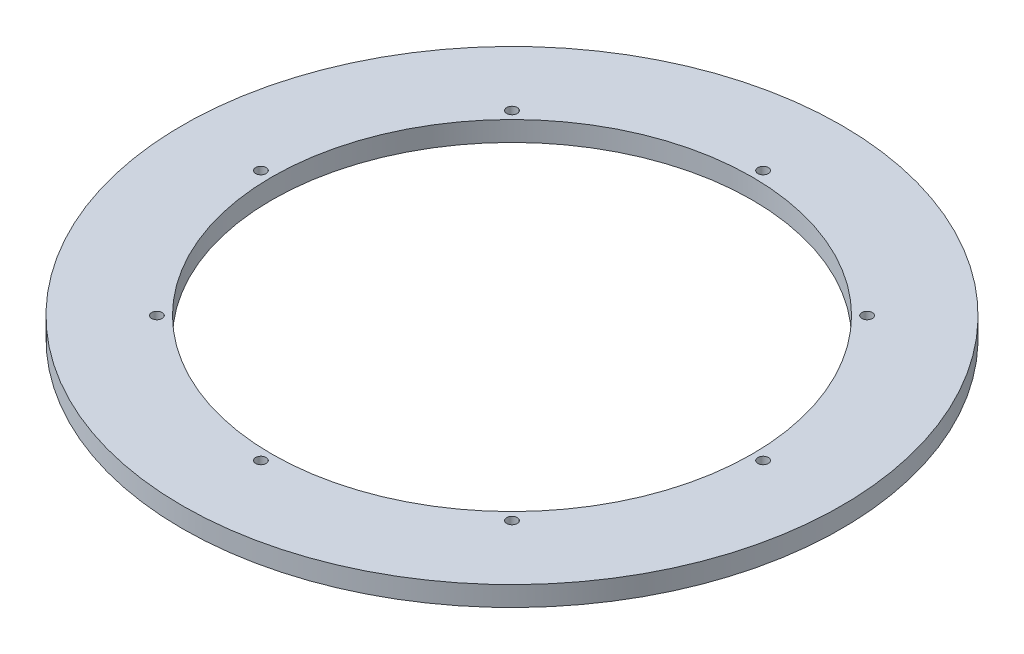
ISO-10303-21;
HEADER;
FILE_DESCRIPTION(('STEP AP214'),'2;1');
FILE_NAME('part.step','',(''),(''),'','','');
FILE_SCHEMA(('AUTOMOTIVE_DESIGN { 1 0 10303 214 1 1 1 1 }'));
ENDSEC;
DATA;
#1=APPLICATION_CONTEXT('core data for automotive mechanical design processes');
#2=APPLICATION_PROTOCOL_DEFINITION('international standard','automotive_design',2000,#1);
#3=PRODUCT_CONTEXT('',#1,'mechanical');
#4=PRODUCT('Part','Part','',(#3));
#5=PRODUCT_RELATED_PRODUCT_CATEGORY('part','',(#4));
#6=PRODUCT_DEFINITION_FORMATION('','',#4);
#7=PRODUCT_DEFINITION_CONTEXT('part definition',#1,'design');
#8=PRODUCT_DEFINITION('design','',#6,#7);
#9=PRODUCT_DEFINITION_SHAPE('','',#8);
#10=(LENGTH_UNIT() NAMED_UNIT(*) SI_UNIT(.MILLI.,.METRE.));
#11=(NAMED_UNIT(*) PLANE_ANGLE_UNIT() SI_UNIT($,.RADIAN.));
#12=(NAMED_UNIT(*) SI_UNIT($,.STERADIAN.) SOLID_ANGLE_UNIT());
#13=UNCERTAINTY_MEASURE_WITH_UNIT(LENGTH_MEASURE(1.E-05),#10,'distance_accuracy_value','');
#14=(GEOMETRIC_REPRESENTATION_CONTEXT(3) GLOBAL_UNCERTAINTY_ASSIGNED_CONTEXT((#13)) GLOBAL_UNIT_ASSIGNED_CONTEXT((#10,
#11,#12)) REPRESENTATION_CONTEXT('',''));
#15=CARTESIAN_POINT('',(0.,0.,0.));
#16=DIRECTION('',(0.,0.,1.));
#17=DIRECTION('',(1.,0.,0.));
#18=AXIS2_PLACEMENT_3D('',#15,#16,#17);
#19=CARTESIAN_POINT('',(0.,-6970.88671751028,0.));
#20=DIRECTION('',(0.,-1.,0.));
#21=DIRECTION('',(0.,0.,-1.));
#22=AXIS2_PLACEMENT_3D('',#19,#20,#21);
#23=CYLINDRICAL_SURFACE('',#22,229.5);
#24=CARTESIAN_POINT('',(0.,-8.77937800467343,0.));
#25=DIRECTION('',(0.,-1.,0.));
#26=DIRECTION('',(0.,0.,-1.));
#27=AXIS2_PLACEMENT_3D('',#24,#25,#26);
#28=CIRCLE('',#27,229.5);
#29=CARTESIAN_POINT('',(0.,-8.77937800467343,-229.5));
#30=VERTEX_POINT('',#29);
#31=EDGE_CURVE('E10',#30,#30,#28,.T.);
#32=ORIENTED_EDGE('',*,*,#31,.F.);
#33=EDGE_LOOP('',(#32));
#34=FACE_BOUND('',#33,.T.);
#35=CARTESIAN_POINT('',(0.,-27.7793780046736,0.));
#36=DIRECTION('',(0.,-1.,0.));
#37=DIRECTION('',(0.,0.,-1.));
#38=AXIS2_PLACEMENT_3D('',#35,#36,#37);
#39=CIRCLE('',#38,229.5);
#40=CARTESIAN_POINT('',(0.,-27.7793780046736,-229.5));
#41=VERTEX_POINT('',#40);
#42=EDGE_CURVE('E54',#41,#41,#39,.T.);
#43=ORIENTED_EDGE('',*,*,#42,.T.);
#44=EDGE_LOOP('',(#43));
#45=FACE_BOUND('',#44,.T.);
#46=ADVANCED_FACE('F37',(#34,#45),#23,.F.);
#47=CARTESIAN_POINT('',(0.,-8.77937800467338,315.));
#48=DIRECTION('',(0.,-1.,0.));
#49=DIRECTION('',(0.,0.,-1.));
#50=AXIS2_PLACEMENT_3D('',#47,#48,#49);
#51=PLANE('',#50);
#52=CARTESIAN_POINT('',(0.,-8.77937800467338,-240.));
#53=DIRECTION('',(0.,1.,0.));
#54=DIRECTION('',(0.,0.,1.));
#55=AXIS2_PLACEMENT_3D('',#52,#53,#54);
#56=CIRCLE('',#55,5.);
#57=CARTESIAN_POINT('',(0.,-8.77937800467338,-235.));
#58=VERTEX_POINT('',#57);
#59=EDGE_CURVE('E117',#58,#58,#56,.T.);
#60=ORIENTED_EDGE('',*,*,#59,.F.);
#61=EDGE_LOOP('',(#60));
#62=FACE_BOUND('',#61,.T.);
#63=CARTESIAN_POINT('',(169.705627484772,-8.77937800467338,-169.705627484771));
#64=DIRECTION('',(0.,1.,0.));
#65=DIRECTION('',(0.,0.,1.));
#66=AXIS2_PLACEMENT_3D('',#63,#64,#65);
#67=CIRCLE('',#66,4.99999999999999);
#68=CARTESIAN_POINT('',(169.705627484772,-8.77937800467338,-164.705627484771));
#69=VERTEX_POINT('',#68);
#70=EDGE_CURVE('E109',#69,#69,#67,.T.);
#71=ORIENTED_EDGE('',*,*,#70,.F.);
#72=EDGE_LOOP('',(#71));
#73=FACE_BOUND('',#72,.T.);
#74=CARTESIAN_POINT('',(240.,-8.77937800467338,8.37955521322352E-13));
#75=DIRECTION('',(0.,1.,0.));
#76=DIRECTION('',(0.,0.,1.));
#77=AXIS2_PLACEMENT_3D('',#74,#75,#76);
#78=CIRCLE('',#77,4.99999999999999);
#79=CARTESIAN_POINT('',(240.,-8.77937800467338,5.00000000000083));
#80=VERTEX_POINT('',#79);
#81=EDGE_CURVE('E101',#80,#80,#78,.T.);
#82=ORIENTED_EDGE('',*,*,#81,.F.);
#83=EDGE_LOOP('',(#82));
#84=FACE_BOUND('',#83,.T.);
#85=CARTESIAN_POINT('',(169.70562748477,-8.77937800467338,169.705627484772));
#86=DIRECTION('',(0.,1.,0.));
#87=DIRECTION('',(0.,0.,1.));
#88=AXIS2_PLACEMENT_3D('',#85,#86,#87);
#89=CIRCLE('',#88,5.00000000000002);
#90=CARTESIAN_POINT('',(169.70562748477,-8.77937800467338,174.705627484772));
#91=VERTEX_POINT('',#90);
#92=EDGE_CURVE('E93',#91,#91,#89,.T.);
#93=ORIENTED_EDGE('',*,*,#92,.F.);
#94=EDGE_LOOP('',(#93));
#95=FACE_BOUND('',#94,.T.);
#96=CARTESIAN_POINT('',(-1.6759110426447E-12,-8.77937800467338,240.));
#97=DIRECTION('',(0.,1.,0.));
#98=DIRECTION('',(0.,0.,1.));
#99=AXIS2_PLACEMENT_3D('',#96,#97,#98);
#100=CIRCLE('',#99,5.);
#101=CARTESIAN_POINT('',(-1.6759110426447E-12,-8.77937800467338,245.));
#102=VERTEX_POINT('',#101);
#103=EDGE_CURVE('E85',#102,#102,#100,.T.);
#104=ORIENTED_EDGE('',*,*,#103,.F.);
#105=EDGE_LOOP('',(#104));
#106=FACE_BOUND('',#105,.T.);
#107=CARTESIAN_POINT('',(-169.705627484773,-8.77937800467338,169.70562748477));
#108=DIRECTION('',(0.,1.,0.));
#109=DIRECTION('',(0.,0.,1.));
#110=AXIS2_PLACEMENT_3D('',#107,#108,#109);
#111=CIRCLE('',#110,5.00000000000002);
#112=CARTESIAN_POINT('',(-169.705627484773,-8.77937800467338,174.70562748477));
#113=VERTEX_POINT('',#112);
#114=EDGE_CURVE('E77',#113,#113,#111,.T.);
#115=ORIENTED_EDGE('',*,*,#114,.F.);
#116=EDGE_LOOP('',(#115));
#117=FACE_BOUND('',#116,.T.);
#118=CARTESIAN_POINT('',(-240.,-8.77937800467338,-2.51386656396706E-12));
#119=DIRECTION('',(0.,1.,0.));
#120=DIRECTION('',(0.,0.,1.));
#121=AXIS2_PLACEMENT_3D('',#118,#119,#120);
#122=CIRCLE('',#121,5.00000000000002);
#123=CARTESIAN_POINT('',(-240.,-8.77937800467338,4.9999999999975));
#124=VERTEX_POINT('',#123);
#125=EDGE_CURVE('E69',#124,#124,#122,.T.);
#126=ORIENTED_EDGE('',*,*,#125,.F.);
#127=EDGE_LOOP('',(#126));
#128=FACE_BOUND('',#127,.T.);
#129=CARTESIAN_POINT('',(-169.705627484769,-8.77937800467338,-169.705627484773));
#130=DIRECTION('',(0.,1.,0.));
#131=DIRECTION('',(0.,0.,1.));
#132=AXIS2_PLACEMENT_3D('',#129,#130,#131);
#133=CIRCLE('',#132,5.00000000000002);
#134=CARTESIAN_POINT('',(-169.705627484769,-8.77937800467338,-164.705627484773));
#135=VERTEX_POINT('',#134);
#136=EDGE_CURVE('E61',#135,#135,#133,.T.);
#137=ORIENTED_EDGE('',*,*,#136,.F.);
#138=EDGE_LOOP('',(#137));
#139=FACE_BOUND('',#138,.T.);
#140=CARTESIAN_POINT('',(0.,-8.77937800467343,0.));
#141=DIRECTION('',(0.,-1.,0.));
#142=DIRECTION('',(0.,0.,-1.));
#143=AXIS2_PLACEMENT_3D('',#140,#141,#142);
#144=CIRCLE('',#143,315.);
#145=CARTESIAN_POINT('',(0.,-8.77937800467343,-315.));
#146=VERTEX_POINT('',#145);
#147=EDGE_CURVE('E44',#146,#146,#144,.T.);
#148=ORIENTED_EDGE('',*,*,#147,.F.);
#149=EDGE_LOOP('',(#148));
#150=FACE_BOUND('',#149,.T.);
#151=ORIENTED_EDGE('',*,*,#31,.T.);
#152=EDGE_LOOP('',(#151));
#153=FACE_BOUND('',#152,.T.);
#154=ADVANCED_FACE('F135',(#62,#73,#84,#95,#106,#117,#128,#139,#150,#153),#51,.F.);
#155=CARTESIAN_POINT('',(0.,-6970.88671751028,0.));
#156=DIRECTION('',(0.,-1.,0.));
#157=DIRECTION('',(0.,0.,-1.));
#158=AXIS2_PLACEMENT_3D('',#155,#156,#157);
#159=CYLINDRICAL_SURFACE('',#158,315.);
#160=CARTESIAN_POINT('',(0.,-27.7793780046736,0.));
#161=DIRECTION('',(0.,-1.,0.));
#162=DIRECTION('',(0.,0.,-1.));
#163=AXIS2_PLACEMENT_3D('',#160,#161,#162);
#164=CIRCLE('',#163,315.);
#165=CARTESIAN_POINT('',(0.,-27.7793780046736,-315.));
#166=VERTEX_POINT('',#165);
#167=EDGE_CURVE('E49',#166,#166,#164,.T.);
#168=ORIENTED_EDGE('',*,*,#167,.F.);
#169=EDGE_LOOP('',(#168));
#170=FACE_BOUND('',#169,.T.);
#171=ORIENTED_EDGE('',*,*,#147,.T.);
#172=EDGE_LOOP('',(#171));
#173=FACE_BOUND('',#172,.T.);
#174=ADVANCED_FACE('F138',(#170,#173),#159,.T.);
#175=CARTESIAN_POINT('',(0.,-27.7793780046734,315.));
#176=DIRECTION('',(0.,1.,0.));
#177=DIRECTION('',(0.,0.,1.));
#178=AXIS2_PLACEMENT_3D('',#175,#176,#177);
#179=PLANE('',#178);
#180=CARTESIAN_POINT('',(0.,-27.7793780046736,-240.));
#181=DIRECTION('',(0.,1.,0.));
#182=DIRECTION('',(0.,0.,1.));
#183=AXIS2_PLACEMENT_3D('',#180,#181,#182);
#184=CIRCLE('',#183,5.);
#185=CARTESIAN_POINT('',(0.,-27.7793780046736,-235.));
#186=VERTEX_POINT('',#185);
#187=EDGE_CURVE('E60',#186,#186,#184,.T.);
#188=ORIENTED_EDGE('',*,*,#187,.T.);
#189=EDGE_LOOP('',(#188));
#190=FACE_BOUND('',#189,.T.);
#191=CARTESIAN_POINT('',(169.705627484772,-27.7793780046736,-169.705627484771));
#192=DIRECTION('',(0.,1.,0.));
#193=DIRECTION('',(0.,0.,1.));
#194=AXIS2_PLACEMENT_3D('',#191,#192,#193);
#195=CIRCLE('',#194,4.99999999999999);
#196=CARTESIAN_POINT('',(169.705627484772,-27.7793780046736,-164.705627484771));
#197=VERTEX_POINT('',#196);
#198=EDGE_CURVE('E113',#197,#197,#195,.T.);
#199=ORIENTED_EDGE('',*,*,#198,.T.);
#200=EDGE_LOOP('',(#199));
#201=FACE_BOUND('',#200,.T.);
#202=CARTESIAN_POINT('',(240.,-27.7793780046736,8.37955521322352E-13));
#203=DIRECTION('',(0.,1.,0.));
#204=DIRECTION('',(0.,0.,1.));
#205=AXIS2_PLACEMENT_3D('',#202,#203,#204);
#206=CIRCLE('',#205,4.99999999999999);
#207=CARTESIAN_POINT('',(240.,-27.7793780046736,5.00000000000083));
#208=VERTEX_POINT('',#207);
#209=EDGE_CURVE('E105',#208,#208,#206,.T.);
#210=ORIENTED_EDGE('',*,*,#209,.T.);
#211=EDGE_LOOP('',(#210));
#212=FACE_BOUND('',#211,.T.);
#213=CARTESIAN_POINT('',(169.70562748477,-27.7793780046736,169.705627484772));
#214=DIRECTION('',(0.,1.,0.));
#215=DIRECTION('',(0.,0.,1.));
#216=AXIS2_PLACEMENT_3D('',#213,#214,#215);
#217=CIRCLE('',#216,5.00000000000002);
#218=CARTESIAN_POINT('',(169.70562748477,-27.7793780046736,174.705627484772));
#219=VERTEX_POINT('',#218);
#220=EDGE_CURVE('E97',#219,#219,#217,.T.);
#221=ORIENTED_EDGE('',*,*,#220,.T.);
#222=EDGE_LOOP('',(#221));
#223=FACE_BOUND('',#222,.T.);
#224=CARTESIAN_POINT('',(-1.6759110426447E-12,-27.7793780046736,240.));
#225=DIRECTION('',(0.,1.,0.));
#226=DIRECTION('',(0.,0.,1.));
#227=AXIS2_PLACEMENT_3D('',#224,#225,#226);
#228=CIRCLE('',#227,5.);
#229=CARTESIAN_POINT('',(-1.6759110426447E-12,-27.7793780046736,245.));
#230=VERTEX_POINT('',#229);
#231=EDGE_CURVE('E89',#230,#230,#228,.T.);
#232=ORIENTED_EDGE('',*,*,#231,.T.);
#233=EDGE_LOOP('',(#232));
#234=FACE_BOUND('',#233,.T.);
#235=CARTESIAN_POINT('',(-169.705627484773,-27.7793780046736,169.70562748477));
#236=DIRECTION('',(0.,1.,0.));
#237=DIRECTION('',(0.,0.,1.));
#238=AXIS2_PLACEMENT_3D('',#235,#236,#237);
#239=CIRCLE('',#238,5.00000000000002);
#240=CARTESIAN_POINT('',(-169.705627484773,-27.7793780046736,174.70562748477));
#241=VERTEX_POINT('',#240);
#242=EDGE_CURVE('E81',#241,#241,#239,.T.);
#243=ORIENTED_EDGE('',*,*,#242,.T.);
#244=EDGE_LOOP('',(#243));
#245=FACE_BOUND('',#244,.T.);
#246=CARTESIAN_POINT('',(-240.,-27.7793780046736,-2.51386656396706E-12));
#247=DIRECTION('',(0.,1.,0.));
#248=DIRECTION('',(0.,0.,1.));
#249=AXIS2_PLACEMENT_3D('',#246,#247,#248);
#250=CIRCLE('',#249,5.00000000000002);
#251=CARTESIAN_POINT('',(-240.,-27.7793780046736,4.9999999999975));
#252=VERTEX_POINT('',#251);
#253=EDGE_CURVE('E73',#252,#252,#250,.T.);
#254=ORIENTED_EDGE('',*,*,#253,.T.);
#255=EDGE_LOOP('',(#254));
#256=FACE_BOUND('',#255,.T.);
#257=CARTESIAN_POINT('',(-169.705627484769,-27.7793780046736,-169.705627484773));
#258=DIRECTION('',(0.,1.,0.));
#259=DIRECTION('',(0.,0.,1.));
#260=AXIS2_PLACEMENT_3D('',#257,#258,#259);
#261=CIRCLE('',#260,5.00000000000002);
#262=CARTESIAN_POINT('',(-169.705627484769,-27.7793780046736,-164.705627484773));
#263=VERTEX_POINT('',#262);
#264=EDGE_CURVE('E65',#263,#263,#261,.T.);
#265=ORIENTED_EDGE('',*,*,#264,.T.);
#266=EDGE_LOOP('',(#265));
#267=FACE_BOUND('',#266,.T.);
#268=ORIENTED_EDGE('',*,*,#42,.F.);
#269=EDGE_LOOP('',(#268));
#270=FACE_BOUND('',#269,.T.);
#271=ORIENTED_EDGE('',*,*,#167,.T.);
#272=EDGE_LOOP('',(#271));
#273=FACE_BOUND('',#272,.T.);
#274=ADVANCED_FACE('F125',(#190,#201,#212,#223,#234,#245,#256,#267,#270,#273),#179,.F.);
#275=CARTESIAN_POINT('',(-169.705627484769,-27.7793780046736,-169.705627484773));
#276=DIRECTION('',(0.,1.,0.));
#277=DIRECTION('',(0.,0.,1.));
#278=AXIS2_PLACEMENT_3D('',#275,#276,#277);
#279=CYLINDRICAL_SURFACE('',#278,5.00000000000002);
#280=ORIENTED_EDGE('',*,*,#264,.F.);
#281=EDGE_LOOP('',(#280));
#282=FACE_BOUND('',#281,.T.);
#283=ORIENTED_EDGE('',*,*,#136,.T.);
#284=EDGE_LOOP('',(#283));
#285=FACE_BOUND('',#284,.T.);
#286=ADVANCED_FACE('F154',(#282,#285),#279,.F.);
#287=CARTESIAN_POINT('',(-240.,-27.7793780046736,-2.51386656396706E-12));
#288=DIRECTION('',(0.,1.,0.));
#289=DIRECTION('',(0.,0.,1.));
#290=AXIS2_PLACEMENT_3D('',#287,#288,#289);
#291=CYLINDRICAL_SURFACE('',#290,5.00000000000002);
#292=ORIENTED_EDGE('',*,*,#253,.F.);
#293=EDGE_LOOP('',(#292));
#294=FACE_BOUND('',#293,.T.);
#295=ORIENTED_EDGE('',*,*,#125,.T.);
#296=EDGE_LOOP('',(#295));
#297=FACE_BOUND('',#296,.T.);
#298=ADVANCED_FACE('F156',(#294,#297),#291,.F.);
#299=CARTESIAN_POINT('',(-169.705627484773,-27.7793780046736,169.70562748477));
#300=DIRECTION('',(0.,1.,0.));
#301=DIRECTION('',(0.,0.,1.));
#302=AXIS2_PLACEMENT_3D('',#299,#300,#301);
#303=CYLINDRICAL_SURFACE('',#302,5.00000000000002);
#304=ORIENTED_EDGE('',*,*,#242,.F.);
#305=EDGE_LOOP('',(#304));
#306=FACE_BOUND('',#305,.T.);
#307=ORIENTED_EDGE('',*,*,#114,.T.);
#308=EDGE_LOOP('',(#307));
#309=FACE_BOUND('',#308,.T.);
#310=ADVANCED_FACE('F163',(#306,#309),#303,.F.);
#311=CARTESIAN_POINT('',(-1.6759110426447E-12,-27.7793780046736,240.));
#312=DIRECTION('',(0.,1.,0.));
#313=DIRECTION('',(0.,0.,1.));
#314=AXIS2_PLACEMENT_3D('',#311,#312,#313);
#315=CYLINDRICAL_SURFACE('',#314,5.);
#316=ORIENTED_EDGE('',*,*,#231,.F.);
#317=EDGE_LOOP('',(#316));
#318=FACE_BOUND('',#317,.T.);
#319=ORIENTED_EDGE('',*,*,#103,.T.);
#320=EDGE_LOOP('',(#319));
#321=FACE_BOUND('',#320,.T.);
#322=ADVANCED_FACE('F209',(#318,#321),#315,.F.);
#323=CARTESIAN_POINT('',(169.70562748477,-27.7793780046736,169.705627484772));
#324=DIRECTION('',(0.,1.,0.));
#325=DIRECTION('',(0.,0.,1.));
#326=AXIS2_PLACEMENT_3D('',#323,#324,#325);
#327=CYLINDRICAL_SURFACE('',#326,5.00000000000002);
#328=ORIENTED_EDGE('',*,*,#220,.F.);
#329=EDGE_LOOP('',(#328));
#330=FACE_BOUND('',#329,.T.);
#331=ORIENTED_EDGE('',*,*,#92,.T.);
#332=EDGE_LOOP('',(#331));
#333=FACE_BOUND('',#332,.T.);
#334=ADVANCED_FACE('F219',(#330,#333),#327,.F.);
#335=CARTESIAN_POINT('',(240.,-27.7793780046736,8.37955521322352E-13));
#336=DIRECTION('',(0.,1.,0.));
#337=DIRECTION('',(0.,0.,1.));
#338=AXIS2_PLACEMENT_3D('',#335,#336,#337);
#339=CYLINDRICAL_SURFACE('',#338,4.99999999999999);
#340=ORIENTED_EDGE('',*,*,#209,.F.);
#341=EDGE_LOOP('',(#340));
#342=FACE_BOUND('',#341,.T.);
#343=ORIENTED_EDGE('',*,*,#81,.T.);
#344=EDGE_LOOP('',(#343));
#345=FACE_BOUND('',#344,.T.);
#346=ADVANCED_FACE('F229',(#342,#345),#339,.F.);
#347=CARTESIAN_POINT('',(169.705627484772,-27.7793780046736,-169.705627484771));
#348=DIRECTION('',(0.,1.,0.));
#349=DIRECTION('',(0.,0.,1.));
#350=AXIS2_PLACEMENT_3D('',#347,#348,#349);
#351=CYLINDRICAL_SURFACE('',#350,4.99999999999999);
#352=ORIENTED_EDGE('',*,*,#198,.F.);
#353=EDGE_LOOP('',(#352));
#354=FACE_BOUND('',#353,.T.);
#355=ORIENTED_EDGE('',*,*,#70,.T.);
#356=EDGE_LOOP('',(#355));
#357=FACE_BOUND('',#356,.T.);
#358=ADVANCED_FACE('F131',(#354,#357),#351,.F.);
#359=CARTESIAN_POINT('',(0.,-27.7793780046736,-240.));
#360=DIRECTION('',(0.,1.,0.));
#361=DIRECTION('',(0.,0.,1.));
#362=AXIS2_PLACEMENT_3D('',#359,#360,#361);
#363=CYLINDRICAL_SURFACE('',#362,5.);
#364=ORIENTED_EDGE('',*,*,#187,.F.);
#365=EDGE_LOOP('',(#364));
#366=FACE_BOUND('',#365,.T.);
#367=ORIENTED_EDGE('',*,*,#59,.T.);
#368=EDGE_LOOP('',(#367));
#369=FACE_BOUND('',#368,.T.);
#370=ADVANCED_FACE('F128',(#366,#369),#363,.F.);
#371=CLOSED_SHELL('',(#46,#154,#174,#274,#286,#298,#310,#322,#334,#346,#358,#370));
#372=MANIFOLD_SOLID_BREP('B2',#371);
#373=ADVANCED_BREP_SHAPE_REPRESENTATION('',(#18,#372),#14);
#374=SHAPE_DEFINITION_REPRESENTATION(#9,#373);
ENDSEC;
END-ISO-10303-21;
